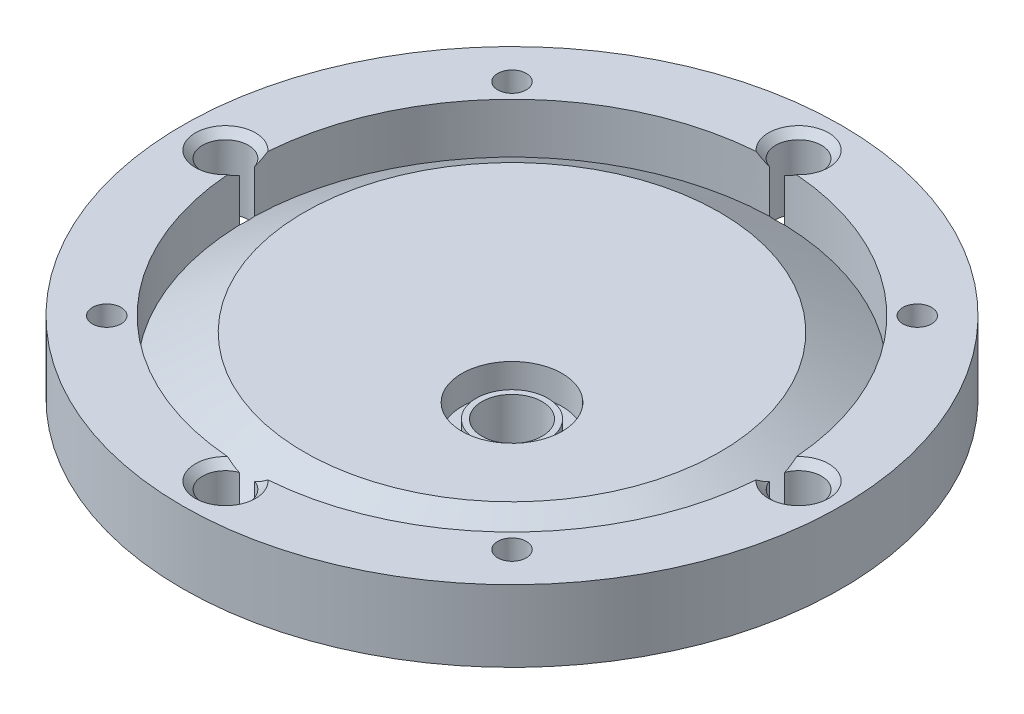
ISO-10303-21;
HEADER;
FILE_DESCRIPTION(('STEP AP214'),'2;1');
FILE_NAME('part.step','',(''),(''),'','','');
FILE_SCHEMA(('AUTOMOTIVE_DESIGN { 1 0 10303 214 1 1 1 1 }'));
ENDSEC;
DATA;
#1=APPLICATION_CONTEXT('core data for automotive mechanical design processes');
#2=APPLICATION_PROTOCOL_DEFINITION('international standard','automotive_design',2000,#1);
#3=PRODUCT_CONTEXT('',#1,'mechanical');
#4=PRODUCT('Part','Part','',(#3));
#5=PRODUCT_RELATED_PRODUCT_CATEGORY('part','',(#4));
#6=PRODUCT_DEFINITION_FORMATION('','',#4);
#7=PRODUCT_DEFINITION_CONTEXT('part definition',#1,'design');
#8=PRODUCT_DEFINITION('design','',#6,#7);
#9=PRODUCT_DEFINITION_SHAPE('','',#8);
#10=(LENGTH_UNIT() NAMED_UNIT(*) SI_UNIT(.MILLI.,.METRE.));
#11=(NAMED_UNIT(*) PLANE_ANGLE_UNIT() SI_UNIT($,.RADIAN.));
#12=(NAMED_UNIT(*) SI_UNIT($,.STERADIAN.) SOLID_ANGLE_UNIT());
#13=UNCERTAINTY_MEASURE_WITH_UNIT(LENGTH_MEASURE(1.E-05),#10,'distance_accuracy_value','');
#14=(GEOMETRIC_REPRESENTATION_CONTEXT(3) GLOBAL_UNCERTAINTY_ASSIGNED_CONTEXT((#13)) GLOBAL_UNIT_ASSIGNED_CONTEXT((#10,
#11,#12)) REPRESENTATION_CONTEXT('',''));
#15=CARTESIAN_POINT('',(0.,0.,0.));
#16=DIRECTION('',(0.,0.,1.));
#17=DIRECTION('',(1.,0.,0.));
#18=AXIS2_PLACEMENT_3D('',#15,#16,#17);
#19=CARTESIAN_POINT('',(4.24264068711929,0.,4.24264068711928));
#20=DIRECTION('',(0.,1.,0.));
#21=DIRECTION('',(0.,0.,1.));
#22=AXIS2_PLACEMENT_3D('',#19,#20,#21);
#23=CYLINDRICAL_SURFACE('',#22,2.1);
#24=CARTESIAN_POINT('',(4.24264068711929,0.,4.24264068711928));
#25=DIRECTION('',(0.,1.,0.));
#26=DIRECTION('',(0.,0.,1.));
#27=AXIS2_PLACEMENT_3D('',#24,#25,#26);
#28=CIRCLE('',#27,2.1);
#29=CARTESIAN_POINT('',(4.24264068711929,0.,6.34264068711928));
#30=VERTEX_POINT('',#29);
#31=EDGE_CURVE('E325',#30,#30,#28,.T.);
#32=ORIENTED_EDGE('',*,*,#31,.F.);
#33=EDGE_LOOP('',(#32));
#34=FACE_BOUND('',#33,.T.);
#35=CARTESIAN_POINT('',(4.24264068711929,3.00000000000001,4.24264068711928));
#36=DIRECTION('',(0.,1.,0.));
#37=DIRECTION('',(0.,0.,1.));
#38=AXIS2_PLACEMENT_3D('',#35,#36,#37);
#39=CIRCLE('',#38,2.1);
#40=CARTESIAN_POINT('',(4.24264068711929,3.00000000000001,6.34264068711928));
#41=VERTEX_POINT('',#40);
#42=EDGE_CURVE('E342',#41,#41,#39,.F.);
#43=ORIENTED_EDGE('',*,*,#42,.F.);
#44=EDGE_LOOP('',(#43));
#45=FACE_BOUND('',#44,.T.);
#46=ADVANCED_FACE('F45',(#34,#45),#23,.F.);
#47=CARTESIAN_POINT('',(4.24264068711929,2.00000000000001,4.24264068711928));
#48=DIRECTION('',(0.,1.,0.));
#49=DIRECTION('',(0.,0.,1.));
#50=AXIS2_PLACEMENT_3D('',#47,#48,#49);
#51=CYLINDRICAL_SURFACE('',#50,2.5);
#52=CARTESIAN_POINT('',(4.24264068711929,2.00000000000001,4.24264068711928));
#53=DIRECTION('',(0.,1.,0.));
#54=DIRECTION('',(0.,0.,1.));
#55=AXIS2_PLACEMENT_3D('',#52,#53,#54);
#56=CIRCLE('',#55,2.5);
#57=CARTESIAN_POINT('',(4.24264068711929,2.00000000000001,6.74264068711928));
#58=VERTEX_POINT('',#57);
#59=EDGE_CURVE('E346',#58,#58,#56,.T.);
#60=ORIENTED_EDGE('',*,*,#59,.T.);
#61=EDGE_LOOP('',(#60));
#62=FACE_BOUND('',#61,.T.);
#63=CARTESIAN_POINT('',(4.24264068711929,3.00000000000001,4.24264068711928));
#64=DIRECTION('',(0.,1.,0.));
#65=DIRECTION('',(0.,0.,1.));
#66=AXIS2_PLACEMENT_3D('',#63,#64,#65);
#67=CIRCLE('',#66,2.5);
#68=CARTESIAN_POINT('',(4.24264068711929,3.00000000000001,6.74264068711928));
#69=VERTEX_POINT('',#68);
#70=EDGE_CURVE('E340',#69,#69,#67,.F.);
#71=ORIENTED_EDGE('',*,*,#70,.T.);
#72=EDGE_LOOP('',(#71));
#73=FACE_BOUND('',#72,.T.);
#74=ADVANCED_FACE('F241',(#62,#73),#51,.T.);
#75=CARTESIAN_POINT('',(0.,5.,0.));
#76=DIRECTION('',(0.,-1.,0.));
#77=DIRECTION('',(0.,0.,-1.));
#78=AXIS2_PLACEMENT_3D('',#75,#76,#77);
#79=CYLINDRICAL_SURFACE('',#78,23.);
#80=CARTESIAN_POINT('',(0.,5.,0.));
#81=DIRECTION('',(0.,1.,0.));
#82=DIRECTION('',(0.,0.,1.));
#83=AXIS2_PLACEMENT_3D('',#80,#81,#82);
#84=CIRCLE('',#83,23.);
#85=CARTESIAN_POINT('',(0.,5.,23.));
#86=VERTEX_POINT('',#85);
#87=EDGE_CURVE('E170',#86,#86,#84,.T.);
#88=ORIENTED_EDGE('',*,*,#87,.F.);
#89=EDGE_LOOP('',(#88));
#90=FACE_BOUND('',#89,.T.);
#91=CARTESIAN_POINT('',(0.,0.,0.));
#92=DIRECTION('',(0.,1.,0.));
#93=DIRECTION('',(0.,0.,1.));
#94=AXIS2_PLACEMENT_3D('',#91,#92,#93);
#95=CIRCLE('',#94,23.);
#96=CARTESIAN_POINT('',(0.,0.,23.));
#97=VERTEX_POINT('',#96);
#98=EDGE_CURVE('E409',#97,#97,#95,.T.);
#99=ORIENTED_EDGE('',*,*,#98,.T.);
#100=EDGE_LOOP('',(#99));
#101=FACE_BOUND('',#100,.T.);
#102=ADVANCED_FACE('F234',(#90,#101),#79,.T.);
#103=CARTESIAN_POINT('',(0.,5.,0.));
#104=DIRECTION('',(0.,1.,0.));
#105=DIRECTION('',(0.,0.,1.));
#106=AXIS2_PLACEMENT_3D('',#103,#104,#105);
#107=PLANE('',#106);
#108=CARTESIAN_POINT('',(0.,5.00000000000001,0.));
#109=DIRECTION('',(0.,-1.,0.));
#110=DIRECTION('',(0.,0.,-1.));
#111=AXIS2_PLACEMENT_3D('',#108,#109,#110);
#112=CIRCLE('',#111,18.5);
#113=CARTESIAN_POINT('',(1.41247442454723,5.00000000000001,-18.446));
#114=VERTEX_POINT('',#113);
#115=CARTESIAN_POINT('',(18.4460071305784,5.00000000000001,-1.41238130072915));
#116=VERTEX_POINT('',#115);
#117=EDGE_CURVE('E327',#114,#116,#112,.T.);
#118=ORIENTED_EDGE('',*,*,#117,.T.);
#119=CARTESIAN_POINT('',(20.0010000000006,5.,-0.00100000000056088));
#120=DIRECTION('',(0.,1.,0.));
#121=DIRECTION('',(0.,0.,1.));
#122=AXIS2_PLACEMENT_3D('',#119,#120,#121);
#123=CIRCLE('',#122,2.1);
#124=CARTESIAN_POINT('',(18.4461482694259,5.00000000000001,1.4105367851839));
#125=VERTEX_POINT('',#124);
#126=EDGE_CURVE('E328',#116,#125,#123,.F.);
#127=ORIENTED_EDGE('',*,*,#126,.T.);
#128=CARTESIAN_POINT('',(1.41431891600629,5.00000000000001,18.4458586681083));
#129=VERTEX_POINT('',#128);
#130=EDGE_CURVE('E380',#125,#129,#112,.T.);
#131=ORIENTED_EDGE('',*,*,#130,.T.);
#132=CARTESIAN_POINT('',(0.00200000000112175,5.,20.));
#133=DIRECTION('',(0.,1.,0.));
#134=DIRECTION('',(0.,0.,1.));
#135=AXIS2_PLACEMENT_3D('',#132,#133,#134);
#136=CIRCLE('',#135,2.10000000000002);
#137=CARTESIAN_POINT('',(-1.41062971602111,5.00000000000001,18.4461411629717));
#138=VERTEX_POINT('',#137);
#139=EDGE_CURVE('E330',#129,#138,#136,.F.);
#140=ORIENTED_EDGE('',*,*,#139,.T.);
#141=CARTESIAN_POINT('',(-18.4458516220405,5.00000000000001,1.41441080937047));
#142=VERTEX_POINT('',#141);
#143=EDGE_CURVE('E324',#138,#142,#112,.T.);
#144=ORIENTED_EDGE('',*,*,#143,.T.);
#145=CARTESIAN_POINT('',(-19.9989999999994,5.,0.00100000000056333));
#146=DIRECTION('',(0.,1.,0.));
#147=DIRECTION('',(0.,0.,1.));
#148=AXIS2_PLACEMENT_3D('',#145,#146,#147);
#149=CIRCLE('',#148,2.10000000000001);
#150=CARTESIAN_POINT('',(-18.4459929779551,5.00000000000001,-1.41256612490521));
#151=VERTEX_POINT('',#150);
#152=EDGE_CURVE('E323',#142,#151,#149,.F.);
#153=ORIENTED_EDGE('',*,*,#152,.T.);
#154=CARTESIAN_POINT('',(-1.41247442454723,5.00000000000001,-18.446));
#155=VERTEX_POINT('',#154);
#156=EDGE_CURVE('E315',#151,#155,#112,.T.);
#157=ORIENTED_EDGE('',*,*,#156,.T.);
#158=CARTESIAN_POINT('',(0.,5.,-20.));
#159=DIRECTION('',(0.,1.,0.));
#160=DIRECTION('',(0.,0.,1.));
#161=AXIS2_PLACEMENT_3D('',#158,#159,#160);
#162=CIRCLE('',#161,2.10000000000001);
#163=EDGE_CURVE('E321',#155,#114,#162,.F.);
#164=ORIENTED_EDGE('',*,*,#163,.T.);
#165=EDGE_LOOP('',(#118,#127,#131,#140,#144,#153,#157,#164));
#166=FACE_BOUND('',#165,.T.);
#167=CARTESIAN_POINT('',(-14.142135623731,5.,-14.1421356237301));
#168=DIRECTION('',(0.,1.,0.));
#169=DIRECTION('',(0.,0.,1.));
#170=AXIS2_PLACEMENT_3D('',#167,#168,#169);
#171=CIRCLE('',#170,1.);
#172=CARTESIAN_POINT('',(-14.142135623731,5.,-13.1421356237301));
#173=VERTEX_POINT('',#172);
#174=EDGE_CURVE('E387',#173,#173,#171,.T.);
#175=ORIENTED_EDGE('',*,*,#174,.F.);
#176=EDGE_LOOP('',(#175));
#177=FACE_BOUND('',#176,.T.);
#178=CARTESIAN_POINT('',(-14.1421356237301,5.,14.1421356237318));
#179=DIRECTION('',(0.,1.,0.));
#180=DIRECTION('',(0.,0.,1.));
#181=AXIS2_PLACEMENT_3D('',#178,#179,#180);
#182=CIRCLE('',#181,1.);
#183=CARTESIAN_POINT('',(-14.1421356237301,5.,15.1421356237319));
#184=VERTEX_POINT('',#183);
#185=EDGE_CURVE('E394',#184,#184,#182,.T.);
#186=ORIENTED_EDGE('',*,*,#185,.F.);
#187=EDGE_LOOP('',(#186));
#188=FACE_BOUND('',#187,.T.);
#189=CARTESIAN_POINT('',(14.1421356237318,5.,14.1421356237309));
#190=DIRECTION('',(0.,1.,0.));
#191=DIRECTION('',(0.,0.,1.));
#192=AXIS2_PLACEMENT_3D('',#189,#190,#191);
#193=CIRCLE('',#192,1.);
#194=CARTESIAN_POINT('',(14.1421356237318,5.,15.1421356237309));
#195=VERTEX_POINT('',#194);
#196=EDGE_CURVE('E647',#195,#195,#193,.T.);
#197=ORIENTED_EDGE('',*,*,#196,.F.);
#198=EDGE_LOOP('',(#197));
#199=FACE_BOUND('',#198,.T.);
#200=CARTESIAN_POINT('',(14.1421356237309,5.,-14.142135623731));
#201=DIRECTION('',(0.,1.,0.));
#202=DIRECTION('',(0.,0.,1.));
#203=AXIS2_PLACEMENT_3D('',#200,#201,#202);
#204=CIRCLE('',#203,1.00000000000001);
#205=CARTESIAN_POINT('',(14.1421356237309,5.,-13.142135623731));
#206=VERTEX_POINT('',#205);
#207=EDGE_CURVE('E402',#206,#206,#204,.T.);
#208=ORIENTED_EDGE('',*,*,#207,.F.);
#209=EDGE_LOOP('',(#208));
#210=FACE_BOUND('',#209,.T.);
#211=ORIENTED_EDGE('',*,*,#87,.T.);
#212=EDGE_LOOP('',(#211));
#213=FACE_BOUND('',#212,.T.);
#214=ADVANCED_FACE('F231',(#166,#177,#188,#199,#210,#213),#107,.T.);
#215=CARTESIAN_POINT('',(0.,0.,0.));
#216=DIRECTION('',(0.,1.,0.));
#217=DIRECTION('',(0.,0.,1.));
#218=AXIS2_PLACEMENT_3D('',#215,#216,#217);
#219=PLANE('',#218);
#220=ORIENTED_EDGE('',*,*,#31,.T.);
#221=EDGE_LOOP('',(#220));
#222=FACE_BOUND('',#221,.T.);
#223=CARTESIAN_POINT('',(-14.142135623731,0.,-14.1421356237301));
#224=DIRECTION('',(0.,1.,0.));
#225=DIRECTION('',(0.,0.,1.));
#226=AXIS2_PLACEMENT_3D('',#223,#224,#225);
#227=CIRCLE('',#226,1.);
#228=CARTESIAN_POINT('',(-14.142135623731,0.,-13.1421356237301));
#229=VERTEX_POINT('',#228);
#230=EDGE_CURVE('E389',#229,#229,#227,.T.);
#231=ORIENTED_EDGE('',*,*,#230,.T.);
#232=EDGE_LOOP('',(#231));
#233=FACE_BOUND('',#232,.T.);
#234=CARTESIAN_POINT('',(-14.1421356237301,0.,14.1421356237318));
#235=DIRECTION('',(0.,1.,0.));
#236=DIRECTION('',(0.,0.,1.));
#237=AXIS2_PLACEMENT_3D('',#234,#235,#236);
#238=CIRCLE('',#237,1.);
#239=CARTESIAN_POINT('',(-14.1421356237301,0.,15.1421356237319));
#240=VERTEX_POINT('',#239);
#241=EDGE_CURVE('E649',#240,#240,#238,.T.);
#242=ORIENTED_EDGE('',*,*,#241,.T.);
#243=EDGE_LOOP('',(#242));
#244=FACE_BOUND('',#243,.T.);
#245=CARTESIAN_POINT('',(14.1421356237318,0.,14.1421356237309));
#246=DIRECTION('',(0.,1.,0.));
#247=DIRECTION('',(0.,0.,1.));
#248=AXIS2_PLACEMENT_3D('',#245,#246,#247);
#249=CIRCLE('',#248,1.);
#250=CARTESIAN_POINT('',(14.1421356237318,0.,15.1421356237309));
#251=VERTEX_POINT('',#250);
#252=EDGE_CURVE('E405',#251,#251,#249,.T.);
#253=ORIENTED_EDGE('',*,*,#252,.T.);
#254=EDGE_LOOP('',(#253));
#255=FACE_BOUND('',#254,.T.);
#256=CARTESIAN_POINT('',(14.1421356237309,0.,-14.142135623731));
#257=DIRECTION('',(0.,1.,0.));
#258=DIRECTION('',(0.,0.,1.));
#259=AXIS2_PLACEMENT_3D('',#256,#257,#258);
#260=CIRCLE('',#259,1.00000000000001);
#261=CARTESIAN_POINT('',(14.1421356237309,0.,-13.142135623731));
#262=VERTEX_POINT('',#261);
#263=EDGE_CURVE('E398',#262,#262,#260,.T.);
#264=ORIENTED_EDGE('',*,*,#263,.T.);
#265=EDGE_LOOP('',(#264));
#266=FACE_BOUND('',#265,.T.);
#267=CARTESIAN_POINT('',(0.,0.,-20.));
#268=DIRECTION('',(0.,1.,0.));
#269=DIRECTION('',(0.,0.,1.));
#270=AXIS2_PLACEMENT_3D('',#267,#268,#269);
#271=CIRCLE('',#270,1.6);
#272=CARTESIAN_POINT('',(0.,0.,-18.4));
#273=VERTEX_POINT('',#272);
#274=EDGE_CURVE('E406',#273,#273,#271,.T.);
#275=ORIENTED_EDGE('',*,*,#274,.T.);
#276=EDGE_LOOP('',(#275));
#277=FACE_BOUND('',#276,.T.);
#278=CARTESIAN_POINT('',(20.0010000000006,0.,-0.00100000000056088));
#279=DIRECTION('',(0.,1.,0.));
#280=DIRECTION('',(0.,0.,1.));
#281=AXIS2_PLACEMENT_3D('',#278,#279,#280);
#282=CIRCLE('',#281,1.6);
#283=CARTESIAN_POINT('',(20.0010000000006,0.,1.59899999999944));
#284=VERTEX_POINT('',#283);
#285=EDGE_CURVE('E410',#284,#284,#282,.T.);
#286=ORIENTED_EDGE('',*,*,#285,.T.);
#287=EDGE_LOOP('',(#286));
#288=FACE_BOUND('',#287,.T.);
#289=CARTESIAN_POINT('',(0.00200000000112175,0.,20.));
#290=DIRECTION('',(0.,1.,0.));
#291=DIRECTION('',(0.,0.,1.));
#292=AXIS2_PLACEMENT_3D('',#289,#290,#291);
#293=CIRCLE('',#292,1.6);
#294=CARTESIAN_POINT('',(0.00200000000112175,0.,21.6));
#295=VERTEX_POINT('',#294);
#296=EDGE_CURVE('E413',#295,#295,#293,.T.);
#297=ORIENTED_EDGE('',*,*,#296,.T.);
#298=EDGE_LOOP('',(#297));
#299=FACE_BOUND('',#298,.T.);
#300=CARTESIAN_POINT('',(-19.9989999999994,0.,0.00100000000056333));
#301=DIRECTION('',(0.,1.,0.));
#302=DIRECTION('',(0.,0.,1.));
#303=AXIS2_PLACEMENT_3D('',#300,#301,#302);
#304=CIRCLE('',#303,1.6);
#305=CARTESIAN_POINT('',(-19.9989999999994,0.,1.60100000000057));
#306=VERTEX_POINT('',#305);
#307=EDGE_CURVE('E401',#306,#306,#304,.T.);
#308=ORIENTED_EDGE('',*,*,#307,.T.);
#309=EDGE_LOOP('',(#308));
#310=FACE_BOUND('',#309,.T.);
#311=ORIENTED_EDGE('',*,*,#98,.F.);
#312=EDGE_LOOP('',(#311));
#313=FACE_BOUND('',#312,.T.);
#314=ADVANCED_FACE('F229',(#222,#233,#244,#255,#266,#277,#288,#299,#310,#313),#219,.F.);
#315=CARTESIAN_POINT('',(-19.9989999999994,0.,0.00100000000056333));
#316=DIRECTION('',(0.,1.,0.));
#317=DIRECTION('',(0.,0.,1.));
#318=AXIS2_PLACEMENT_3D('',#315,#316,#317);
#319=CYLINDRICAL_SURFACE('',#318,1.6);
#320=ORIENTED_EDGE('',*,*,#307,.F.);
#321=EDGE_LOOP('',(#320));
#322=FACE_BOUND('',#321,.T.);
#323=DIRECTION('',(0.,-1.,0.));
#324=VECTOR('',#323,1.);
#325=CARTESIAN_POINT('',(-18.4922015153878,3.25000000000001,-0.53710624115639));
#326=LINE('',#325,#324);
#327=CARTESIAN_POINT('',(-18.4922015153878,1.50000000000001,-0.53710624115639));
#328=VERTEX_POINT('',#327);
#329=CARTESIAN_POINT('',(-18.4922015153878,4.5,-0.53710624115639));
#330=VERTEX_POINT('',#329);
#331=EDGE_CURVE('E373',#328,#330,#326,.F.);
#332=ORIENTED_EDGE('',*,*,#331,.T.);
#333=CARTESIAN_POINT('',(-19.9989999999994,4.5,0.00100000000056333));
#334=DIRECTION('',(0.,1.,0.));
#335=DIRECTION('',(0.,0.,1.));
#336=AXIS2_PLACEMENT_3D('',#333,#334,#335);
#337=CIRCLE('',#336,1.6);
#338=CARTESIAN_POINT('',(-18.4921477096079,4.5,0.538955551084179));
#339=VERTEX_POINT('',#338);
#340=EDGE_CURVE('E308',#330,#339,#337,.T.);
#341=ORIENTED_EDGE('',*,*,#340,.T.);
#342=DIRECTION('',(0.,-1.,0.));
#343=VECTOR('',#342,1.);
#344=CARTESIAN_POINT('',(-18.4921477096079,3.25000000000001,0.538955551084179));
#345=LINE('',#344,#343);
#346=CARTESIAN_POINT('',(-18.4921477096079,1.50000000000001,0.538955551084183));
#347=VERTEX_POINT('',#346);
#348=EDGE_CURVE('E372',#339,#347,#345,.T.);
#349=ORIENTED_EDGE('',*,*,#348,.T.);
#350=CARTESIAN_POINT('',(-18.4924436855502,1.49979999999999,0.539783881898481));
#351=CARTESIAN_POINT('',(-18.4799660635695,1.50823158609413,0.504895427620696));
#352=CARTESIAN_POINT('',(-18.4686476279681,1.51588890095534,0.469418672112459));
#353=CARTESIAN_POINT('',(-18.4484455553974,1.52956755084915,0.397458884878368));
#354=CARTESIAN_POINT('',(-18.4395627051006,1.53558835729851,0.360975532208361));
#355=CARTESIAN_POINT('',(-18.4167759125721,1.55104198074886,0.250415385566867));
#356=CARTESIAN_POINT('',(-18.4066959023108,1.55789161472404,0.175123618660208));
#357=CARTESIAN_POINT('',(-18.3973456859424,1.56424768448493,0.0234208931998635));
#358=CARTESIAN_POINT('',(-18.3981012416876,1.56373661999785,-0.0529923009648408));
#359=CARTESIAN_POINT('',(-18.410434395292,1.55536587705391,-0.204463123552526));
#360=CARTESIAN_POINT('',(-18.421997117787,1.54751629958054,-0.279522470735365));
#361=CARTESIAN_POINT('',(-18.4457744731063,1.53140460557733,-0.384419083689955));
#362=CARTESIAN_POINT('',(-18.4538775123825,1.52591664703587,-0.415694869130331));
#363=CARTESIAN_POINT('',(-18.4718688659968,1.51374213396252,-0.477435119812607));
#364=CARTESIAN_POINT('',(-18.4817543087607,1.50705750746664,-0.507900800897596));
#365=CARTESIAN_POINT('',(-18.4924975741658,1.49979999999999,-0.53793454236748));
#366=B_SPLINE_CURVE_WITH_KNOTS('',3,(#350,#351,#352,#353,#354,#355,#356,#357,#358,#359,#360,
#361,#362,#363,#364,#365),.UNSPECIFIED.,.F.,.F.,(4,2,2,2,2,2,2,4),(0.,0.113941223184152,
0.227919205143645,0.455536176174594,0.683694402266542,0.911539045114597,1.00978797277594,
1.10788000645948),.UNSPECIFIED.);
#367=EDGE_CURVE('E212',#347,#328,#366,.T.);
#368=ORIENTED_EDGE('',*,*,#367,.T.);
#369=EDGE_LOOP('',(#332,#341,#349,#368));
#370=FACE_BOUND('',#369,.T.);
#371=ADVANCED_FACE('F223',(#322,#370),#319,.F.);
#372=CARTESIAN_POINT('',(0.00200000000112175,0.,20.));
#373=DIRECTION('',(0.,1.,0.));
#374=DIRECTION('',(0.,0.,1.));
#375=AXIS2_PLACEMENT_3D('',#372,#373,#374);
#376=CYLINDRICAL_SURFACE('',#375,1.6);
#377=ORIENTED_EDGE('',*,*,#296,.F.);
#378=EDGE_LOOP('',(#377));
#379=FACE_BOUND('',#378,.T.);
#380=DIRECTION('',(0.,-1.,0.));
#381=VECTOR('',#380,1.);
#382=CARTESIAN_POINT('',(-0.533584856679702,3.25000000000001,18.4923034584857));
#383=LINE('',#382,#381);
#384=CARTESIAN_POINT('',(-0.5335848566797,1.50000000000001,18.4923034584857));
#385=VERTEX_POINT('',#384);
#386=CARTESIAN_POINT('',(-0.533584856679702,4.49999999999999,18.4923034584857));
#387=VERTEX_POINT('',#386);
#388=EDGE_CURVE('E370',#385,#387,#383,.F.);
#389=ORIENTED_EDGE('',*,*,#388,.T.);
#390=CARTESIAN_POINT('',(0.00200000000112175,4.49999999999999,20.));
#391=DIRECTION('',(0.,1.,0.));
#392=DIRECTION('',(0.,0.,1.));
#393=AXIS2_PLACEMENT_3D('',#390,#391,#392);
#394=CIRCLE('',#393,1.6);
#395=CARTESIAN_POINT('',(0.537283306664792,4.49999999999999,18.4921963716693));
#396=VERTEX_POINT('',#395);
#397=EDGE_CURVE('E12',#387,#396,#394,.T.);
#398=ORIENTED_EDGE('',*,*,#397,.T.);
#399=DIRECTION('',(0.,-1.,0.));
#400=VECTOR('',#399,1.);
#401=CARTESIAN_POINT('',(0.537283306664792,3.25000000000001,18.4921963716693));
#402=LINE('',#401,#400);
#403=CARTESIAN_POINT('',(0.53728330666479,1.50000000000001,18.4921963716693));
#404=VERTEX_POINT('',#403);
#405=EDGE_CURVE('E368',#396,#404,#402,.T.);
#406=ORIENTED_EDGE('',*,*,#405,.T.);
#407=CARTESIAN_POINT('',(0.538116132145196,1.49979999999999,18.4924922909468));
#408=CARTESIAN_POINT('',(0.503204385218313,1.50819175674648,18.480075990398));
#409=CARTESIAN_POINT('',(0.467706953366847,1.51580821354009,18.4688202363597));
#410=CARTESIAN_POINT('',(0.395711681394473,1.52940348197465,18.4487457235385));
#411=CARTESIAN_POINT('',(0.359213524433517,1.53538176821073,18.4399277466075));
#412=CARTESIAN_POINT('',(0.248615821413265,1.55070652347647,18.4173371870559));
#413=CARTESIAN_POINT('',(0.173310685385911,1.5574677498567,18.4073912669268));
#414=CARTESIAN_POINT('',(0.0216111667647776,1.5636468106995,18.3983092908058));
#415=CARTESIAN_POINT('',(-0.0547853637707475,1.56304730985689,18.3991987532682));
#416=CARTESIAN_POINT('',(-0.206194116530977,1.55450584970699,18.4117910684841));
#417=CARTESIAN_POINT('',(-0.28120814433816,1.54657427960234,18.4234786208312));
#418=CARTESIAN_POINT('',(-0.385150839656772,1.53048838724168,18.447223961214));
#419=CARTESIAN_POINT('',(-0.415545784455648,1.52513800127754,18.4551256244483));
#420=CARTESIAN_POINT('',(-0.475567596498889,1.51330460863996,18.4726159151214));
#421=CARTESIAN_POINT('',(-0.505195611634004,1.50682342233515,18.4822018314121));
#422=CARTESIAN_POINT('',(-0.534417622959585,1.49979999999999,18.4925995443223));
#423=B_SPLINE_CURVE_WITH_KNOTS('',3,(#407,#408,#409,#410,#411,#412,#413,#414,#415,#416,#417,
#418,#419,#420,#421,#422),.UNSPECIFIED.,.F.,.F.,(4,2,2,2,2,2,2,4),(0.,0.113918609973318,
0.227873714024082,0.45545338917108,0.683569141562702,0.911362159129585,1.00687674653312,
1.10223896930503),.UNSPECIFIED.);
#424=EDGE_CURVE('E205',#404,#385,#423,.T.);
#425=ORIENTED_EDGE('',*,*,#424,.T.);
#426=EDGE_LOOP('',(#389,#398,#406,#425));
#427=FACE_BOUND('',#426,.T.);
#428=ADVANCED_FACE('F219',(#379,#427),#376,.F.);
#429=CARTESIAN_POINT('',(20.0010000000006,0.,-0.00100000000056088));
#430=DIRECTION('',(0.,1.,0.));
#431=DIRECTION('',(0.,0.,1.));
#432=AXIS2_PLACEMENT_3D('',#429,#430,#431);
#433=CYLINDRICAL_SURFACE('',#432,1.6);
#434=ORIENTED_EDGE('',*,*,#285,.F.);
#435=EDGE_LOOP('',(#434));
#436=FACE_BOUND('',#435,.T.);
#437=DIRECTION('',(0.,-1.,0.));
#438=VECTOR('',#437,1.);
#439=CARTESIAN_POINT('',(18.4923520273464,3.25000000000001,0.531898953466591));
#440=LINE('',#439,#438);
#441=CARTESIAN_POINT('',(18.4923520273464,1.50000000000001,0.53189895346659));
#442=VERTEX_POINT('',#441);
#443=CARTESIAN_POINT('',(18.4923520273464,4.50000000000001,0.531898953466591));
#444=VERTEX_POINT('',#443);
#445=EDGE_CURVE('E365',#442,#444,#440,.F.);
#446=ORIENTED_EDGE('',*,*,#445,.T.);
#447=CARTESIAN_POINT('',(20.0010000000006,4.50000000000001,-0.00100000000056088));
#448=DIRECTION('',(0.,1.,0.));
#449=DIRECTION('',(0.,0.,1.));
#450=AXIS2_PLACEMENT_3D('',#447,#448,#449);
#451=CIRCLE('',#450,1.6);
#452=CARTESIAN_POINT('',(18.492298747658,4.50000000000001,-0.533748093549373));
#453=VERTEX_POINT('',#452);
#454=EDGE_CURVE('E149',#444,#453,#451,.T.);
#455=ORIENTED_EDGE('',*,*,#454,.T.);
#456=DIRECTION('',(0.,-1.,0.));
#457=VECTOR('',#456,1.);
#458=CARTESIAN_POINT('',(18.492298747658,3.25000000000001,-0.533748093549373));
#459=LINE('',#458,#457);
#460=CARTESIAN_POINT('',(18.492298747658,1.50000000000001,-0.533748093549374));
#461=VERTEX_POINT('',#460);
#462=EDGE_CURVE('E363',#453,#461,#459,.T.);
#463=ORIENTED_EDGE('',*,*,#462,.T.);
#464=CARTESIAN_POINT('',(18.4925946935529,1.4998,-0.534585449090564));
#465=CARTESIAN_POINT('',(18.4802365071261,1.50815173153797,-0.499651548363272));
#466=CARTESIAN_POINT('',(18.469040177489,1.51572712839603,-0.46413447807188));
#467=CARTESIAN_POINT('',(18.4490866224478,1.529238603409,-0.392105586115633));
#468=CARTESIAN_POINT('',(18.4403301740079,1.53517415936211,-0.355593451633194));
#469=CARTESIAN_POINT('',(18.4179257102618,1.55036941182889,-0.244960277148612));
#470=CARTESIAN_POINT('',(18.4081069870778,1.55704179353455,-0.169642697682701));
#471=CARTESIAN_POINT('',(18.3992793538586,1.5630429777414,-0.017947305269715));
#472=CARTESIAN_POINT('',(18.4002957170484,1.56235461102329,0.0584325712887552));
#473=CARTESIAN_POINT('',(18.4131332707215,1.55364161567535,0.209780203419905));
#474=CARTESIAN_POINT('',(18.424938727882,1.54562766965377,0.284749853047594));
#475=CARTESIAN_POINT('',(18.4486385906585,1.52956966283698,0.387736945373872));
#476=CARTESIAN_POINT('',(18.4563335199105,1.52435841146395,0.417247880080964));
#477=CARTESIAN_POINT('',(18.4733144199371,1.51286771194793,0.475544179921114));
#478=CARTESIAN_POINT('',(18.4825978400613,1.50658997637997,0.504330624666664));
#479=CARTESIAN_POINT('',(18.4926480569712,1.4998,0.532736279410492));
#480=B_SPLINE_CURVE_WITH_KNOTS('',3,(#464,#465,#466,#467,#468,#469,#470,#471,#472,#473,#474,
#475,#476,#477,#478,#479),.UNSPECIFIED.,.F.,.F.,(4,2,2,2,2,2,2,4),(0.,0.113896314958602,
0.227828858116107,0.455372048060901,0.683446106511004,0.911188103068288,1.00395423092355,
1.09657277788991),.UNSPECIFIED.);
#481=EDGE_CURVE('E160',#461,#442,#480,.T.);
#482=ORIENTED_EDGE('',*,*,#481,.T.);
#483=EDGE_LOOP('',(#446,#455,#463,#482));
#484=FACE_BOUND('',#483,.T.);
#485=ADVANCED_FACE('F222',(#436,#484),#433,.F.);
#486=CARTESIAN_POINT('',(0.,0.,-20.));
#487=DIRECTION('',(0.,1.,0.));
#488=DIRECTION('',(0.,0.,1.));
#489=AXIS2_PLACEMENT_3D('',#486,#487,#488);
#490=CYLINDRICAL_SURFACE('',#489,1.6);
#491=ORIENTED_EDGE('',*,*,#274,.F.);
#492=EDGE_LOOP('',(#491));
#493=FACE_BOUND('',#492,.T.);
#494=DIRECTION('',(0.,-1.,0.));
#495=VECTOR('',#494,1.);
#496=CARTESIAN_POINT('',(0.535434344714647,3.25000000000001,-18.49225));
#497=LINE('',#496,#495);
#498=CARTESIAN_POINT('',(0.535434344714646,1.50000000000001,-18.49225));
#499=VERTEX_POINT('',#498);
#500=CARTESIAN_POINT('',(0.535434344714647,4.5,-18.49225));
#501=VERTEX_POINT('',#500);
#502=EDGE_CURVE('E137',#499,#501,#497,.F.);
#503=ORIENTED_EDGE('',*,*,#502,.T.);
#504=CARTESIAN_POINT('',(0.,4.5,-20.));
#505=DIRECTION('',(0.,1.,0.));
#506=DIRECTION('',(0.,0.,1.));
#507=AXIS2_PLACEMENT_3D('',#504,#505,#506);
#508=CIRCLE('',#507,1.6);
#509=CARTESIAN_POINT('',(-0.535434344714647,4.5,-18.49225));
#510=VERTEX_POINT('',#509);
#511=EDGE_CURVE('E272',#501,#510,#508,.T.);
#512=ORIENTED_EDGE('',*,*,#511,.T.);
#513=DIRECTION('',(0.,-1.,0.));
#514=VECTOR('',#513,1.);
#515=CARTESIAN_POINT('',(-0.535434344714647,3.25000000000001,-18.49225));
#516=LINE('',#515,#514);
#517=CARTESIAN_POINT('',(-0.535434344714646,1.50000000000001,-18.49225));
#518=VERTEX_POINT('',#517);
#519=EDGE_CURVE('E167',#510,#518,#516,.T.);
#520=ORIENTED_EDGE('',*,*,#519,.T.);
#521=CARTESIAN_POINT('',(-0.536267140147736,1.49979999999999,-18.49254600256));
#522=CARTESIAN_POINT('',(-0.50135663729806,1.50819176073916,-18.480126204927));
#523=CARTESIAN_POINT('',(-0.465860333215508,1.51580822162861,-18.4688668950968));
#524=CARTESIAN_POINT('',(-0.393867072510216,1.5294034984218,-18.4487851704232));
#525=CARTESIAN_POINT('',(-0.357369798968839,1.53538178892035,-18.4399635374006));
#526=CARTESIAN_POINT('',(-0.246774359209834,1.55070655710447,-18.4173618990757));
#527=CARTESIAN_POINT('',(-0.171470219442281,1.55746779234718,-18.4074084354186));
#528=CARTESIAN_POINT('',(-0.0197716094119187,1.56364687093402,-18.3983112632625));
#529=CARTESIAN_POINT('',(0.0566250113530725,1.56304737895641,-18.399193073027));
#530=CARTESIAN_POINT('',(0.208035028745942,1.55450593591891,-18.4117702220848));
#531=CARTESIAN_POINT('',(0.283050229417489,1.54657437403259,-18.4234502608339));
#532=CARTESIAN_POINT('',(0.386995394225825,1.53048847898808,-18.4471852106975));
#533=CARTESIAN_POINT('',(0.417391217281637,1.52513807918901,-18.4550838547983));
#534=CARTESIAN_POINT('',(0.477414950251615,1.51330465236122,-18.4725681937162));
#535=CARTESIAN_POINT('',(0.507044007792225,1.50682344571189,-18.4821511772542));
#536=CARTESIAN_POINT('',(0.536267140147732,1.4998,-18.49254600256));
#537=B_SPLINE_CURVE_WITH_KNOTS('',3,(#521,#522,#523,#524,#525,#526,#527,#528,#529,#530,#531,
#532,#533,#534,#535,#536),.UNSPECIFIED.,.F.,.F.,(4,2,2,2,2,2,2,4),(0.,0.113918612218793,
0.22787371854156,0.455453397377809,0.683569153978,0.911362176677318,1.00687703821741,
1.10223953465991),.UNSPECIFIED.);
#538=EDGE_CURVE('E150',#518,#499,#537,.T.);
#539=ORIENTED_EDGE('',*,*,#538,.T.);
#540=EDGE_LOOP('',(#503,#512,#520,#539));
#541=FACE_BOUND('',#540,.T.);
#542=ADVANCED_FACE('F165',(#493,#541),#490,.F.);
#543=CARTESIAN_POINT('',(14.1421356237309,0.,-14.142135623731));
#544=DIRECTION('',(0.,1.,0.));
#545=DIRECTION('',(0.,0.,1.));
#546=AXIS2_PLACEMENT_3D('',#543,#544,#545);
#547=CYLINDRICAL_SURFACE('',#546,1.00000000000001);
#548=ORIENTED_EDGE('',*,*,#263,.F.);
#549=EDGE_LOOP('',(#548));
#550=FACE_BOUND('',#549,.T.);
#551=ORIENTED_EDGE('',*,*,#207,.T.);
#552=EDGE_LOOP('',(#551));
#553=FACE_BOUND('',#552,.T.);
#554=ADVANCED_FACE('F569',(#550,#553),#547,.F.);
#555=CARTESIAN_POINT('',(14.1421356237318,0.,14.1421356237309));
#556=DIRECTION('',(0.,1.,0.));
#557=DIRECTION('',(0.,0.,1.));
#558=AXIS2_PLACEMENT_3D('',#555,#556,#557);
#559=CYLINDRICAL_SURFACE('',#558,1.);
#560=ORIENTED_EDGE('',*,*,#252,.F.);
#561=EDGE_LOOP('',(#560));
#562=FACE_BOUND('',#561,.T.);
#563=ORIENTED_EDGE('',*,*,#196,.T.);
#564=EDGE_LOOP('',(#563));
#565=FACE_BOUND('',#564,.T.);
#566=ADVANCED_FACE('F560',(#562,#565),#559,.F.);
#567=CARTESIAN_POINT('',(-14.1421356237301,0.,14.1421356237318));
#568=DIRECTION('',(0.,1.,0.));
#569=DIRECTION('',(0.,0.,1.));
#570=AXIS2_PLACEMENT_3D('',#567,#568,#569);
#571=CYLINDRICAL_SURFACE('',#570,1.);
#572=ORIENTED_EDGE('',*,*,#241,.F.);
#573=EDGE_LOOP('',(#572));
#574=FACE_BOUND('',#573,.T.);
#575=ORIENTED_EDGE('',*,*,#185,.T.);
#576=EDGE_LOOP('',(#575));
#577=FACE_BOUND('',#576,.T.);
#578=ADVANCED_FACE('F551',(#574,#577),#571,.F.);
#579=CARTESIAN_POINT('',(-14.142135623731,0.,-14.1421356237301));
#580=DIRECTION('',(0.,1.,0.));
#581=DIRECTION('',(0.,0.,1.));
#582=AXIS2_PLACEMENT_3D('',#579,#580,#581);
#583=CYLINDRICAL_SURFACE('',#582,1.);
#584=ORIENTED_EDGE('',*,*,#230,.F.);
#585=EDGE_LOOP('',(#584));
#586=FACE_BOUND('',#585,.T.);
#587=ORIENTED_EDGE('',*,*,#174,.T.);
#588=EDGE_LOOP('',(#587));
#589=FACE_BOUND('',#588,.T.);
#590=ADVANCED_FACE('F188',(#586,#589),#583,.F.);
#591=CARTESIAN_POINT('',(0.,4.00000000000001,0.));
#592=DIRECTION('',(0.,-1.,0.));
#593=DIRECTION('',(0.,0.,-1.));
#594=AXIS2_PLACEMENT_3D('',#591,#592,#593);
#595=CONICAL_SURFACE('',#594,14.5,1.01219701145133);
#596=CARTESIAN_POINT('',(0.,4.00000000000001,0.));
#597=DIRECTION('',(0.,-1.,0.));
#598=DIRECTION('',(0.,0.,-1.));
#599=AXIS2_PLACEMENT_3D('',#596,#597,#598);
#600=CIRCLE('',#599,14.5);
#601=CARTESIAN_POINT('',(0.,4.00000000000001,-14.5));
#602=VERTEX_POINT('',#601);
#603=EDGE_CURVE('E161',#602,#602,#600,.T.);
#604=ORIENTED_EDGE('',*,*,#603,.T.);
#605=EDGE_LOOP('',(#604));
#606=FACE_BOUND('',#605,.T.);
#607=CARTESIAN_POINT('',(0.,1.50000000000001,0.));
#608=DIRECTION('',(0.,-1.,0.));
#609=DIRECTION('',(0.,0.,-1.));
#610=AXIS2_PLACEMENT_3D('',#607,#608,#609);
#611=CIRCLE('',#610,18.5);
#612=EDGE_CURVE('E386',#385,#347,#611,.T.);
#613=ORIENTED_EDGE('',*,*,#612,.F.);
#614=ORIENTED_EDGE('',*,*,#424,.F.);
#615=EDGE_CURVE('E162',#442,#404,#611,.T.);
#616=ORIENTED_EDGE('',*,*,#615,.F.);
#617=ORIENTED_EDGE('',*,*,#481,.F.);
#618=EDGE_CURVE('E141',#499,#461,#611,.T.);
#619=ORIENTED_EDGE('',*,*,#618,.F.);
#620=ORIENTED_EDGE('',*,*,#538,.F.);
#621=EDGE_CURVE('E164',#328,#518,#611,.T.);
#622=ORIENTED_EDGE('',*,*,#621,.F.);
#623=ORIENTED_EDGE('',*,*,#367,.F.);
#624=EDGE_LOOP('',(#613,#614,#616,#617,#619,#620,#622,#623));
#625=FACE_BOUND('',#624,.T.);
#626=ADVANCED_FACE('F156',(#606,#625),#595,.T.);
#627=CARTESIAN_POINT('',(0.,0.,0.));
#628=DIRECTION('',(0.,-1.,0.));
#629=DIRECTION('',(0.,0.,-1.));
#630=AXIS2_PLACEMENT_3D('',#627,#628,#629);
#631=CYLINDRICAL_SURFACE('',#630,18.5);
#632=ORIENTED_EDGE('',*,*,#519,.F.);
#633=CARTESIAN_POINT('',(-0.535434344714647,4.5,-18.49225));
#634=CARTESIAN_POINT('',(-0.575317801965181,4.51444006047941,-18.4910949970945));
#635=CARTESIAN_POINT('',(-0.614724262865209,4.53011569909109,-18.489825101824));
#636=CARTESIAN_POINT('',(-0.692597288666632,4.56355117889531,-18.4870718794256));
#637=CARTESIAN_POINT('',(-0.731064657241771,4.5813091566641,-18.4855887428562));
#638=CARTESIAN_POINT('',(-0.844824827922608,4.63699357652884,-18.4808555034754));
#639=CARTESIAN_POINT('',(-0.918851049984006,4.67747386063507,-18.477310377207));
#640=CARTESIAN_POINT('',(-1.06391665795753,4.76301827199481,-18.4695248355759));
#641=CARTESIAN_POINT('',(-1.13496138247206,4.80807366479302,-18.4652857359599));
#642=CARTESIAN_POINT('',(-1.24000797175315,4.87822551032674,-18.4584294251361));
#643=CARTESIAN_POINT('',(-1.27485294790381,4.90209878931305,-18.4560546591005));
#644=CARTESIAN_POINT('',(-1.3440307035886,4.95054977095702,-18.4511458364885));
#645=CARTESIAN_POINT('',(-1.37836356231637,4.97512736294632,-18.4486118048636));
#646=CARTESIAN_POINT('',(-1.41247442454723,5.,-18.446));
#647=B_SPLINE_CURVE_WITH_KNOTS('',3,(#633,#634,#635,#636,#637,#638,#639,#640,#641,#642,#643,
#644,#645,#646),.UNSPECIFIED.,.F.,.F.,(4,2,2,2,2,2,4),(0.,0.127240333086284,0.254367659229926,
0.507421741681612,0.760001484744151,0.886910060434944,1.01379880321402),.UNSPECIFIED.);
#648=EDGE_CURVE('E286',#510,#155,#647,.T.);
#649=ORIENTED_EDGE('',*,*,#648,.T.);
#650=ORIENTED_EDGE('',*,*,#156,.F.);
#651=CARTESIAN_POINT('',(-18.4459929779551,5.,-1.41256612490521));
#652=CARTESIAN_POINT('',(-18.4486007042401,4.97515121932096,-1.37851076650264));
#653=CARTESIAN_POINT('',(-18.4511308905864,4.95059599421046,-1.34423438308059));
#654=CARTESIAN_POINT('',(-18.4560325150113,4.90218599242194,-1.2751719149458));
#655=CARTESIAN_POINT('',(-18.4584039284465,4.87833132479958,-1.24038575212599));
#656=CARTESIAN_POINT('',(-18.4652511921061,4.80822629490751,-1.13551602991142));
#657=CARTESIAN_POINT('',(-18.4694853504649,4.76319241759308,-1.0645931378992));
#658=CARTESIAN_POINT('',(-18.477263373434,4.67766388115935,-0.919785544948287));
#659=CARTESIAN_POINT('',(-18.4808059388495,4.63717782478524,-0.845895578116967));
#660=CARTESIAN_POINT('',(-18.4855376591347,4.58145236920423,-0.732351424801185));
#661=CARTESIAN_POINT('',(-18.487020655203,4.56367553660374,-0.693958982475019));
#662=CARTESIAN_POINT('',(-18.4897745194536,4.53018875978218,-0.616238946268173));
#663=CARTESIAN_POINT('',(-18.4910451997506,4.51448064881637,-0.576910558925932));
#664=CARTESIAN_POINT('',(-18.4922015153878,4.49999999999999,-0.537106241156395));
#665=B_SPLINE_CURVE_WITH_KNOTS('',3,(#651,#652,#653,#654,#655,#656,#657,#658,#659,#660,#661,
#662,#663,#664),.UNSPECIFIED.,.F.,.F.,(4,2,2,2,2,2,4),(0.,0.126711631958155,0.253442885646472,
0.505680229490978,0.758386949162595,0.885334671870837,1.01239414651757),.UNSPECIFIED.);
#666=EDGE_CURVE('E280',#151,#330,#665,.T.);
#667=ORIENTED_EDGE('',*,*,#666,.T.);
#668=ORIENTED_EDGE('',*,*,#331,.F.);
#669=ORIENTED_EDGE('',*,*,#621,.T.);
#670=EDGE_LOOP('',(#632,#649,#650,#667,#668,#669));
#671=FACE_BOUND('',#670,.T.);
#672=ADVANCED_FACE('F187',(#671),#631,.F.);
#673=ORIENTED_EDGE('',*,*,#348,.F.);
#674=CARTESIAN_POINT('',(-18.4921477096079,4.5,0.538955551084179));
#675=CARTESIAN_POINT('',(-18.4909874133457,4.51448064881638,0.578759753017331));
#676=CARTESIAN_POINT('',(-18.4897128000196,4.53018875978218,0.618088013088528));
#677=CARTESIAN_POINT('',(-18.4869511633906,4.56367553660374,0.695807773506541));
#678=CARTESIAN_POINT('',(-18.4854643278935,4.58145236920423,0.734200067333704));
#679=CARTESIAN_POINT('',(-18.4807212526489,4.63717782478523,0.847743746886022));
#680=CARTESIAN_POINT('',(-18.477171297885,4.67766388115935,0.9216333590736));
#681=CARTESIAN_POINT('',(-18.4693787934714,4.76319241759308,1.06644017345922));
#682=CARTESIAN_POINT('',(-18.46513754249,4.80822629490752,1.13736264167978));
#683=CARTESIAN_POINT('',(-18.458279791368,4.87833132479958,1.24223167860934));
#684=CARTESIAN_POINT('',(-18.4559048991545,4.90218599242194,1.277017604102));
#685=CARTESIAN_POINT('',(-18.4509963681619,4.95059599421046,1.3460795817045));
#686=CARTESIAN_POINT('',(-18.4484627540186,4.97515121932096,1.38035571192386));
#687=CARTESIAN_POINT('',(-18.4458516220405,5.,1.41441080937047));
#688=B_SPLINE_CURVE_WITH_KNOTS('',3,(#674,#675,#676,#677,#678,#679,#680,#681,#682,#683,#684,
#685,#686,#687),.UNSPECIFIED.,.F.,.F.,(4,2,2,2,2,2,4),(0.,0.127059474646736,0.254007197354979,
0.506713917026597,0.758951260871103,0.885682514559419,1.01239414651757),.UNSPECIFIED.);
#689=EDGE_CURVE('E55',#339,#142,#688,.T.);
#690=ORIENTED_EDGE('',*,*,#689,.T.);
#691=ORIENTED_EDGE('',*,*,#143,.F.);
#692=CARTESIAN_POINT('',(-1.41062971602111,5.,18.4461411629717));
#693=CARTESIAN_POINT('',(-1.37651858719429,4.97512736054822,18.4487495569743));
#694=CARTESIAN_POINT('',(-1.34218546955182,4.95054976631044,18.4512801555144));
#695=CARTESIAN_POINT('',(-1.27300721173026,4.90209878054671,18.4561820607017));
#696=CARTESIAN_POINT('',(-1.23816199235993,4.87822549968929,18.4585533423895));
#697=CARTESIAN_POINT('',(-1.13311470018049,4.80807364944895,18.465399148901));
#698=CARTESIAN_POINT('',(-1.06206953985768,4.76301825448738,18.4696311441625));
#699=CARTESIAN_POINT('',(-0.917003128109861,4.67747384153082,18.4774021792195));
#700=CARTESIAN_POINT('',(-0.842976538206717,4.63699355800444,18.4809399027328));
#701=CARTESIAN_POINT('',(-0.729215873056873,4.58130914226513,18.4856617656528));
#702=CARTESIAN_POINT('',(-0.690748348829413,4.56355116639204,18.4871410552984));
#703=CARTESIAN_POINT('',(-0.612875032719885,4.53011569174535,18.4898864899239));
#704=CARTESIAN_POINT('',(-0.573468437182105,4.51444005639856,18.4911524442645));
#705=CARTESIAN_POINT('',(-0.533584856679703,4.49999999999999,18.4923034584857));
#706=B_SPLINE_CURVE_WITH_KNOTS('',3,(#692,#693,#694,#695,#696,#697,#698,#699,#700,#701,#702,
#703,#704,#705),.UNSPECIFIED.,.F.,.F.,(4,2,2,2,2,2,4),(0.,0.126888760567666,0.253797354068335,
0.506377131517381,0.759431248855612,0.886558593038958,1.0137989442914),.UNSPECIFIED.);
#707=EDGE_CURVE('E62',#138,#387,#706,.T.);
#708=ORIENTED_EDGE('',*,*,#707,.T.);
#709=ORIENTED_EDGE('',*,*,#388,.F.);
#710=ORIENTED_EDGE('',*,*,#612,.T.);
#711=EDGE_LOOP('',(#673,#690,#691,#708,#709,#710));
#712=FACE_BOUND('',#711,.T.);
#713=ADVANCED_FACE('F526',(#712),#631,.F.);
#714=ORIENTED_EDGE('',*,*,#130,.F.);
#715=CARTESIAN_POINT('',(18.4461482694259,5.,1.4105367851839));
#716=CARTESIAN_POINT('',(18.4487607678536,4.97510325580731,1.37636970411609));
#717=CARTESIAN_POINT('',(18.4512952350764,4.95050305982426,1.34197965425212));
#718=CARTESIAN_POINT('',(18.4562043800346,4.9020106603453,1.27268517364938));
#719=CARTESIAN_POINT('',(18.4585790324968,4.87811856916203,1.23778066261253));
#720=CARTESIAN_POINT('',(18.4654339294244,4.80791940398809,1.13255508345766));
#721=CARTESIAN_POINT('',(18.4696708831101,4.76284225811188,1.06138711565399));
#722=CARTESIAN_POINT('',(18.4774494450901,4.67728178426173,0.916060602500403));
#723=CARTESIAN_POINT('',(18.4809897202535,4.63680732502913,0.841896644667887));
#724=CARTESIAN_POINT('',(18.4857130615624,4.58116438079135,0.727918204244186));
#725=CARTESIAN_POINT('',(18.4871924737478,4.56342546326402,0.689375138448965));
#726=CARTESIAN_POINT('',(18.4899372199307,4.53004184050109,0.611347590644957));
#727=CARTESIAN_POINT('',(18.4912023605643,4.5143990294737,0.571862294612524));
#728=CARTESIAN_POINT('',(18.4923520273464,4.50000000000001,0.531898953466594));
#729=B_SPLINE_CURVE_WITH_KNOTS('',3,(#715,#716,#717,#718,#719,#720,#721,#722,#723,#724,#725,
#726,#727,#728),.UNSPECIFIED.,.F.,.F.,(4,2,2,2,2,2,4),(0.,0.127067412042488,0.254154871568747,
0.507079960999824,0.760484427520244,0.887792952868815,1.01521575940659),.UNSPECIFIED.);
#730=EDGE_CURVE('E265',#125,#444,#729,.T.);
#731=ORIENTED_EDGE('',*,*,#730,.T.);
#732=ORIENTED_EDGE('',*,*,#445,.F.);
#733=ORIENTED_EDGE('',*,*,#615,.T.);
#734=ORIENTED_EDGE('',*,*,#405,.F.);
#735=CARTESIAN_POINT('',(0.537283306664791,4.49999999999999,18.4921963716693));
#736=CARTESIAN_POINT('',(0.577166656166679,4.51444005639856,18.4910373807551));
#737=CARTESIAN_POINT('',(0.616572997725463,4.53011569174535,18.4897635451208));
#738=CARTESIAN_POINT('',(0.694445763190605,4.56355116639204,18.4870025358871));
#739=CARTESIAN_POINT('',(0.732912990790789,4.58130914226513,18.4855155527664));
#740=CARTESIAN_POINT('',(0.846672709292845,4.63699355800444,18.480770937808));
#741=CARTESIAN_POINT('',(0.920698590170761,4.67747384153082,18.4772184090476));
#742=CARTESIAN_POINT('',(1.06576344481025,4.76301825448738,18.4694183608639));
#743=CARTESIAN_POINT('',(1.13680775731312,4.80807364944894,18.4651721566551));
#744=CARTESIAN_POINT('',(1.24185367823032,4.87822549968929,18.4583053408223));
#745=CARTESIAN_POINT('',(1.27669842264741,4.90209878054671,18.4559270901382));
#746=CARTESIAN_POINT('',(1.34587569870438,4.95054976631045,18.4510113493974));
#747=CARTESIAN_POINT('',(1.38020830954049,4.97512736054822,18.4484738842844));
#748=CARTESIAN_POINT('',(1.41431891600629,5.,18.4458586681083));
#749=B_SPLINE_CURVE_WITH_KNOTS('',3,(#735,#736,#737,#738,#739,#740,#741,#742,#743,#744,#745,
#746,#747,#748),.UNSPECIFIED.,.F.,.F.,(4,2,2,2,2,2,4),(0.,0.127240351252445,0.254367695435791,
0.507421812774022,0.760001590223069,0.886910183723738,1.0137989442914),.UNSPECIFIED.);
#750=EDGE_CURVE('E273',#396,#129,#749,.T.);
#751=ORIENTED_EDGE('',*,*,#750,.T.);
#752=EDGE_LOOP('',(#714,#731,#732,#733,#734,#751));
#753=FACE_BOUND('',#752,.T.);
#754=ADVANCED_FACE('F382',(#753),#631,.F.);
#755=ORIENTED_EDGE('',*,*,#462,.F.);
#756=CARTESIAN_POINT('',(18.492298747658,4.50000000000001,-0.533748093549373));
#757=CARTESIAN_POINT('',(18.4911450847474,4.5143990294737,-0.573711319534578));
#758=CARTESIAN_POINT('',(18.4898759957879,4.53004184050109,-0.613196488861867));
#759=CARTESIAN_POINT('',(18.4871234472541,4.56342546326402,-0.691223761814882));
#760=CARTESIAN_POINT('',(18.4856401809622,4.58116438079135,-0.729766679483585));
#761=CARTESIAN_POINT('',(18.4809054424028,4.63680732502914,-0.843744647026937));
#762=CARTESIAN_POINT('',(18.4773577512321,4.67728178426173,-0.917908250478855));
#763=CARTESIAN_POINT('',(18.4695646573662,4.76284225811188,-1.06323398508857));
#764=CARTESIAN_POINT('',(18.4653205872608,4.80791940398809,-1.13440152886226));
#765=CARTESIAN_POINT('',(18.4584551683357,4.87811856916203,-1.23962642203563));
#766=CARTESIAN_POINT('',(18.4560770256088,4.9020106603453,-1.2745306954446));
#767=CARTESIAN_POINT('',(18.4511609515735,4.95050305982426,-1.34382468481095));
#768=CARTESIAN_POINT('',(18.4486230455304,4.97510325580731,-1.37821448106894));
#769=CARTESIAN_POINT('',(18.4460071305784,5.,-1.41238130072915));
#770=B_SPLINE_CURVE_WITH_KNOTS('',3,(#756,#757,#758,#759,#760,#761,#762,#763,#764,#765,#766,
#767,#768,#769),.UNSPECIFIED.,.F.,.F.,(4,2,2,2,2,2,4),(0.,0.127422806537776,0.254731331886348,
0.508135798406767,0.761060887837845,0.888148347364104,1.01521575940659),.UNSPECIFIED.);
#771=EDGE_CURVE('E257',#453,#116,#770,.T.);
#772=ORIENTED_EDGE('',*,*,#771,.T.);
#773=ORIENTED_EDGE('',*,*,#117,.F.);
#774=CARTESIAN_POINT('',(1.41247442454723,5.,-18.446));
#775=CARTESIAN_POINT('',(1.37836356231637,4.97512736294632,-18.4486118048636));
#776=CARTESIAN_POINT('',(1.3440307035886,4.95054977095702,-18.4511458364885));
#777=CARTESIAN_POINT('',(1.27485294790381,4.90209878931305,-18.4560546591005));
#778=CARTESIAN_POINT('',(1.24000797175316,4.87822551032675,-18.4584294251361));
#779=CARTESIAN_POINT('',(1.13496138247206,4.80807366479302,-18.4652857359599));
#780=CARTESIAN_POINT('',(1.06391665795753,4.76301827199481,-18.4695248355759));
#781=CARTESIAN_POINT('',(0.918851049984008,4.67747386063507,-18.477310377207));
#782=CARTESIAN_POINT('',(0.844824827922609,4.63699357652885,-18.4808555034754));
#783=CARTESIAN_POINT('',(0.731064657241772,4.5813091566641,-18.4855887428562));
#784=CARTESIAN_POINT('',(0.692597288666634,4.56355117889531,-18.4870718794256));
#785=CARTESIAN_POINT('',(0.614724262865211,4.53011569909109,-18.489825101824));
#786=CARTESIAN_POINT('',(0.575317801965183,4.5144400604794,-18.4910949970945));
#787=CARTESIAN_POINT('',(0.53543434471465,4.49999999999999,-18.49225));
#788=B_SPLINE_CURVE_WITH_KNOTS('',3,(#774,#775,#776,#777,#778,#779,#780,#781,#782,#783,#784,
#785,#786,#787),.UNSPECIFIED.,.F.,.F.,(4,2,2,2,2,2,4),(0.,0.126888742779076,0.253797318469868,
0.506377061532407,0.759431143984093,0.886558470127735,1.01379880321402),.UNSPECIFIED.);
#789=EDGE_CURVE('E144',#114,#501,#788,.T.);
#790=ORIENTED_EDGE('',*,*,#789,.T.);
#791=ORIENTED_EDGE('',*,*,#502,.F.);
#792=ORIENTED_EDGE('',*,*,#618,.T.);
#793=EDGE_LOOP('',(#755,#772,#773,#790,#791,#792));
#794=FACE_BOUND('',#793,.T.);
#795=ADVANCED_FACE('F140',(#794),#631,.F.);
#796=CARTESIAN_POINT('',(0.,4.00000000000001,0.));
#797=DIRECTION('',(0.,1.,0.));
#798=DIRECTION('',(0.,0.,1.));
#799=AXIS2_PLACEMENT_3D('',#796,#797,#798);
#800=PLANE('',#799);
#801=CARTESIAN_POINT('',(4.24264068711929,4.00000000000001,4.24264068711928));
#802=DIRECTION('',(0.,1.,0.));
#803=DIRECTION('',(1.,0.,0.));
#804=AXIS2_PLACEMENT_3D('',#801,#802,#803);
#805=CIRCLE('',#804,3.5);
#806=CARTESIAN_POINT('',(7.74264068711929,4.00000000000001,4.24264068711928));
#807=VERTEX_POINT('',#806);
#808=EDGE_CURVE('E351',#807,#807,#805,.T.);
#809=ORIENTED_EDGE('',*,*,#808,.F.);
#810=EDGE_LOOP('',(#809));
#811=FACE_BOUND('',#810,.T.);
#812=ORIENTED_EDGE('',*,*,#603,.F.);
#813=EDGE_LOOP('',(#812));
#814=FACE_BOUND('',#813,.T.);
#815=ADVANCED_FACE('F192',(#811,#814),#800,.T.);
#816=CARTESIAN_POINT('',(4.24264068711929,2.00000000000001,4.24264068711928));
#817=DIRECTION('',(0.,1.,0.));
#818=DIRECTION('',(0.,0.,1.));
#819=AXIS2_PLACEMENT_3D('',#816,#817,#818);
#820=CYLINDRICAL_SURFACE('',#819,3.5);
#821=ORIENTED_EDGE('',*,*,#808,.T.);
#822=EDGE_LOOP('',(#821));
#823=FACE_BOUND('',#822,.T.);
#824=CARTESIAN_POINT('',(4.24264068711929,2.00000000000001,4.24264068711928));
#825=DIRECTION('',(0.,1.,0.));
#826=DIRECTION('',(1.,0.,0.));
#827=AXIS2_PLACEMENT_3D('',#824,#825,#826);
#828=CIRCLE('',#827,3.5);
#829=CARTESIAN_POINT('',(7.74264068711929,2.00000000000001,4.24264068711928));
#830=VERTEX_POINT('',#829);
#831=EDGE_CURVE('E354',#830,#830,#828,.T.);
#832=ORIENTED_EDGE('',*,*,#831,.F.);
#833=EDGE_LOOP('',(#832));
#834=FACE_BOUND('',#833,.T.);
#835=ADVANCED_FACE('F446',(#823,#834),#820,.F.);
#836=CARTESIAN_POINT('',(4.24264068711929,2.00000000000001,4.24264068711928));
#837=DIRECTION('',(0.,1.,0.));
#838=DIRECTION('',(0.,0.,1.));
#839=AXIS2_PLACEMENT_3D('',#836,#837,#838);
#840=PLANE('',#839);
#841=ORIENTED_EDGE('',*,*,#59,.F.);
#842=EDGE_LOOP('',(#841));
#843=FACE_BOUND('',#842,.T.);
#844=ORIENTED_EDGE('',*,*,#831,.T.);
#845=EDGE_LOOP('',(#844));
#846=FACE_BOUND('',#845,.T.);
#847=ADVANCED_FACE('F449',(#843,#846),#840,.T.);
#848=CARTESIAN_POINT('',(4.24264068711929,3.00000000000001,4.24264068711928));
#849=DIRECTION('',(0.,1.,0.));
#850=DIRECTION('',(0.,0.,1.));
#851=AXIS2_PLACEMENT_3D('',#848,#849,#850);
#852=PLANE('',#851);
#853=ORIENTED_EDGE('',*,*,#70,.F.);
#854=EDGE_LOOP('',(#853));
#855=FACE_BOUND('',#854,.T.);
#856=ORIENTED_EDGE('',*,*,#42,.T.);
#857=EDGE_LOOP('',(#856));
#858=FACE_BOUND('',#857,.T.);
#859=ADVANCED_FACE('F252',(#855,#858),#852,.T.);
#860=CARTESIAN_POINT('',(20.0010000000006,4.50000000000001,-0.00100000000056088));
#861=DIRECTION('',(0.,1.,0.));
#862=DIRECTION('',(0.,0.,1.));
#863=AXIS2_PLACEMENT_3D('',#860,#861,#862);
#864=CONICAL_SURFACE('',#863,1.6,0.785398163397454);
#865=ORIENTED_EDGE('',*,*,#730,.F.);
#866=ORIENTED_EDGE('',*,*,#126,.F.);
#867=ORIENTED_EDGE('',*,*,#771,.F.);
#868=ORIENTED_EDGE('',*,*,#454,.F.);
#869=EDGE_LOOP('',(#865,#866,#867,#868));
#870=FACE_BOUND('',#869,.T.);
#871=ADVANCED_FACE('F244',(#870),#864,.F.);
#872=CARTESIAN_POINT('',(0.,4.5,-20.));
#873=DIRECTION('',(0.,1.,0.));
#874=DIRECTION('',(0.,0.,1.));
#875=AXIS2_PLACEMENT_3D('',#872,#873,#874);
#876=CONICAL_SURFACE('',#875,1.6,0.78539816339745);
#877=ORIENTED_EDGE('',*,*,#789,.F.);
#878=ORIENTED_EDGE('',*,*,#163,.F.);
#879=ORIENTED_EDGE('',*,*,#648,.F.);
#880=ORIENTED_EDGE('',*,*,#511,.F.);
#881=EDGE_LOOP('',(#877,#878,#879,#880));
#882=FACE_BOUND('',#881,.T.);
#883=ADVANCED_FACE('F251',(#882),#876,.F.);
#884=CARTESIAN_POINT('',(-19.9989999999994,4.5,0.00100000000056333));
#885=DIRECTION('',(0.,1.,0.));
#886=DIRECTION('',(0.,0.,1.));
#887=AXIS2_PLACEMENT_3D('',#884,#885,#886);
#888=CONICAL_SURFACE('',#887,1.6,0.785398163397451);
#889=ORIENTED_EDGE('',*,*,#666,.F.);
#890=ORIENTED_EDGE('',*,*,#152,.F.);
#891=ORIENTED_EDGE('',*,*,#689,.F.);
#892=ORIENTED_EDGE('',*,*,#340,.F.);
#893=EDGE_LOOP('',(#889,#890,#891,#892));
#894=FACE_BOUND('',#893,.T.);
#895=ADVANCED_FACE('F293',(#894),#888,.F.);
#896=CARTESIAN_POINT('',(0.00200000000112175,4.49999999999999,20.));
#897=DIRECTION('',(0.,1.,0.));
#898=DIRECTION('',(0.,0.,1.));
#899=AXIS2_PLACEMENT_3D('',#896,#897,#898);
#900=CONICAL_SURFACE('',#899,1.6,0.785398163397453);
#901=ORIENTED_EDGE('',*,*,#707,.F.);
#902=ORIENTED_EDGE('',*,*,#139,.F.);
#903=ORIENTED_EDGE('',*,*,#750,.F.);
#904=ORIENTED_EDGE('',*,*,#397,.F.);
#905=EDGE_LOOP('',(#901,#902,#903,#904));
#906=FACE_BOUND('',#905,.T.);
#907=ADVANCED_FACE('F48',(#906),#900,.F.);
#908=CLOSED_SHELL('',(#46,#74,#102,#214,#314,#371,#428,#485,#542,#554,#566,#578,#590,#626,#672,
#713,#754,#795,#815,#835,#847,#859,#871,#883,#895,#907));
#909=MANIFOLD_SOLID_BREP('B2',#908);
#910=ADVANCED_BREP_SHAPE_REPRESENTATION('',(#18,#909),#14);
#911=SHAPE_DEFINITION_REPRESENTATION(#9,#910);
ENDSEC;
END-ISO-10303-21;
